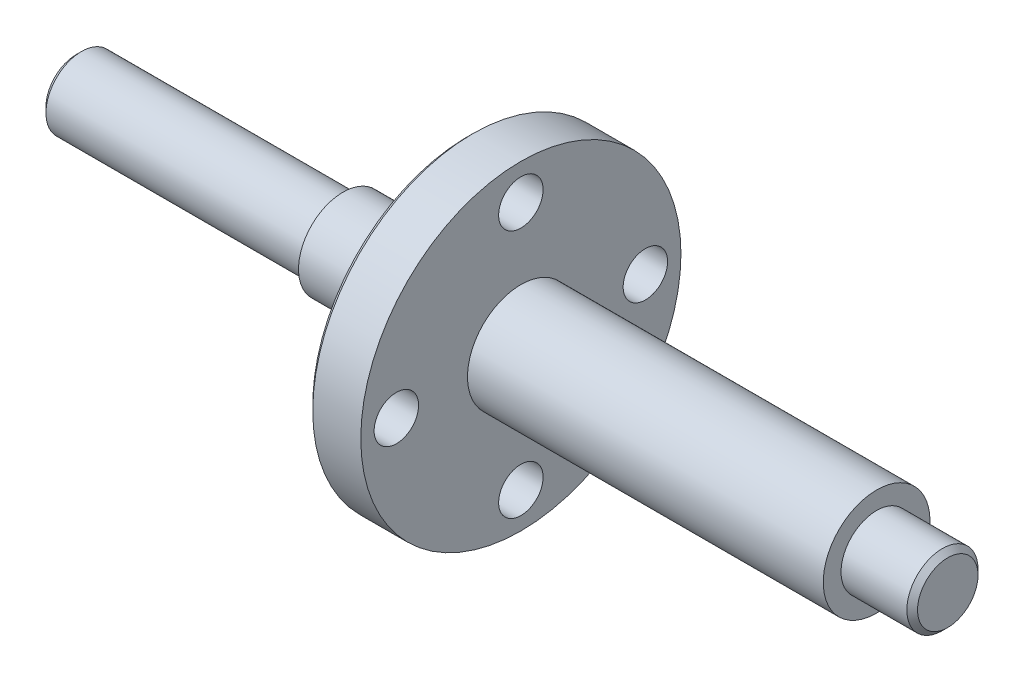
ISO-10303-21;
HEADER;
FILE_DESCRIPTION(('STEP AP214'),'2;1');
FILE_NAME('part.step','',(''),(''),'','','');
FILE_SCHEMA(('AUTOMOTIVE_DESIGN { 1 0 10303 214 1 1 1 1 }'));
ENDSEC;
DATA;
#1=APPLICATION_CONTEXT('core data for automotive mechanical design processes');
#2=APPLICATION_PROTOCOL_DEFINITION('international standard','automotive_design',2000,#1);
#3=PRODUCT_CONTEXT('',#1,'mechanical');
#4=PRODUCT('Part','Part','',(#3));
#5=PRODUCT_RELATED_PRODUCT_CATEGORY('part','',(#4));
#6=PRODUCT_DEFINITION_FORMATION('','',#4);
#7=PRODUCT_DEFINITION_CONTEXT('part definition',#1,'design');
#8=PRODUCT_DEFINITION('design','',#6,#7);
#9=PRODUCT_DEFINITION_SHAPE('','',#8);
#10=(LENGTH_UNIT() NAMED_UNIT(*) SI_UNIT(.MILLI.,.METRE.));
#11=(NAMED_UNIT(*) PLANE_ANGLE_UNIT() SI_UNIT($,.RADIAN.));
#12=(NAMED_UNIT(*) SI_UNIT($,.STERADIAN.) SOLID_ANGLE_UNIT());
#13=UNCERTAINTY_MEASURE_WITH_UNIT(LENGTH_MEASURE(1.E-05),#10,'distance_accuracy_value','');
#14=(GEOMETRIC_REPRESENTATION_CONTEXT(3) GLOBAL_UNCERTAINTY_ASSIGNED_CONTEXT((#13)) GLOBAL_UNIT_ASSIGNED_CONTEXT((#10,
#11,#12)) REPRESENTATION_CONTEXT('',''));
#15=CARTESIAN_POINT('',(0.,0.,0.));
#16=DIRECTION('',(0.,0.,1.));
#17=DIRECTION('',(1.,0.,0.));
#18=AXIS2_PLACEMENT_3D('',#15,#16,#17);
#19=CARTESIAN_POINT('',(22.,0.,0.));
#20=DIRECTION('',(1.,0.,0.));
#21=DIRECTION('',(0.,0.,-1.));
#22=AXIS2_PLACEMENT_3D('',#19,#20,#21);
#23=PLANE('',#22);
#24=CARTESIAN_POINT('',(22.,0.,0.));
#25=DIRECTION('',(1.,0.,0.));
#26=DIRECTION('',(0.,0.,-1.));
#27=AXIS2_PLACEMENT_3D('',#24,#25,#26);
#28=CIRCLE('',#27,8.7);
#29=CARTESIAN_POINT('',(22.,0.,-8.7));
#30=VERTEX_POINT('',#29);
#31=EDGE_CURVE('E54',#30,#30,#28,.F.);
#32=ORIENTED_EDGE('',*,*,#31,.T.);
#33=EDGE_LOOP('',(#32));
#34=FACE_BOUND('',#33,.T.);
#35=CARTESIAN_POINT('',(22.,0.,-7.));
#36=DIRECTION('',(-1.,0.,0.));
#37=DIRECTION('',(0.,0.,1.));
#38=AXIS2_PLACEMENT_3D('',#35,#36,#37);
#39=CIRCLE('',#38,1.24999999999999);
#40=CARTESIAN_POINT('',(22.,0.,-5.75000000000001));
#41=VERTEX_POINT('',#40);
#42=EDGE_CURVE('E108',#41,#41,#39,.T.);
#43=ORIENTED_EDGE('',*,*,#42,.F.);
#44=EDGE_LOOP('',(#43));
#45=FACE_BOUND('',#44,.T.);
#46=CARTESIAN_POINT('',(22.,-7.,0.));
#47=DIRECTION('',(-1.,0.,0.));
#48=DIRECTION('',(0.,0.,1.));
#49=AXIS2_PLACEMENT_3D('',#46,#47,#48);
#50=CIRCLE('',#49,1.24999999999999);
#51=CARTESIAN_POINT('',(22.,-7.,1.24999999999999));
#52=VERTEX_POINT('',#51);
#53=EDGE_CURVE('E102',#52,#52,#50,.T.);
#54=ORIENTED_EDGE('',*,*,#53,.F.);
#55=EDGE_LOOP('',(#54));
#56=FACE_BOUND('',#55,.T.);
#57=CARTESIAN_POINT('',(22.,0.,7.));
#58=DIRECTION('',(-1.,0.,0.));
#59=DIRECTION('',(0.,0.,1.));
#60=AXIS2_PLACEMENT_3D('',#57,#58,#59);
#61=CIRCLE('',#60,1.24999999999999);
#62=CARTESIAN_POINT('',(22.,0.,8.24999999999999));
#63=VERTEX_POINT('',#62);
#64=EDGE_CURVE('E96',#63,#63,#61,.T.);
#65=ORIENTED_EDGE('',*,*,#64,.F.);
#66=EDGE_LOOP('',(#65));
#67=FACE_BOUND('',#66,.T.);
#68=CARTESIAN_POINT('',(22.,0.,0.));
#69=DIRECTION('',(1.,0.,0.));
#70=DIRECTION('',(0.,0.,-1.));
#71=AXIS2_PLACEMENT_3D('',#68,#69,#70);
#72=CIRCLE('',#71,3.);
#73=CARTESIAN_POINT('',(22.,0.,-3.));
#74=VERTEX_POINT('',#73);
#75=EDGE_CURVE('E67',#74,#74,#72,.T.);
#76=ORIENTED_EDGE('',*,*,#75,.T.);
#77=EDGE_LOOP('',(#76));
#78=FACE_BOUND('',#77,.T.);
#79=CARTESIAN_POINT('',(22.,7.,0.));
#80=DIRECTION('',(-1.,0.,0.));
#81=DIRECTION('',(0.,0.,1.));
#82=AXIS2_PLACEMENT_3D('',#79,#80,#81);
#83=CIRCLE('',#82,1.24999999999999);
#84=CARTESIAN_POINT('',(22.,7.,1.24999999999999));
#85=VERTEX_POINT('',#84);
#86=EDGE_CURVE('E90',#85,#85,#83,.T.);
#87=ORIENTED_EDGE('',*,*,#86,.F.);
#88=EDGE_LOOP('',(#87));
#89=FACE_BOUND('',#88,.T.);
#90=ADVANCED_FACE('F34',(#34,#45,#56,#67,#78,#89),#23,.F.);
#91=CARTESIAN_POINT('',(15.,0.,0.));
#92=DIRECTION('',(-1.,0.,0.));
#93=DIRECTION('',(0.,0.,1.));
#94=AXIS2_PLACEMENT_3D('',#91,#92,#93);
#95=CYLINDRICAL_SURFACE('',#94,2.);
#96=CARTESIAN_POINT('',(0.300000000000007,0.,0.));
#97=DIRECTION('',(1.,0.,0.));
#98=DIRECTION('',(0.,0.,-1.));
#99=AXIS2_PLACEMENT_3D('',#96,#97,#98);
#100=CIRCLE('',#99,2.);
#101=CARTESIAN_POINT('',(0.300000000000007,0.,-2.));
#102=VERTEX_POINT('',#101);
#103=EDGE_CURVE('E49',#102,#102,#100,.T.);
#104=ORIENTED_EDGE('',*,*,#103,.T.);
#105=EDGE_LOOP('',(#104));
#106=FACE_BOUND('',#105,.T.);
#107=CARTESIAN_POINT('',(15.,0.,0.));
#108=DIRECTION('',(1.,0.,0.));
#109=DIRECTION('',(0.,0.,-1.));
#110=AXIS2_PLACEMENT_3D('',#107,#108,#109);
#111=CIRCLE('',#110,2.);
#112=CARTESIAN_POINT('',(15.,0.,-2.));
#113=VERTEX_POINT('',#112);
#114=EDGE_CURVE('E60',#113,#113,#111,.T.);
#115=ORIENTED_EDGE('',*,*,#114,.F.);
#116=EDGE_LOOP('',(#115));
#117=FACE_BOUND('',#116,.T.);
#118=ADVANCED_FACE('F117',(#106,#117),#95,.T.);
#119=CARTESIAN_POINT('',(0.,0.,0.));
#120=DIRECTION('',(1.,0.,0.));
#121=DIRECTION('',(0.,0.,-1.));
#122=AXIS2_PLACEMENT_3D('',#119,#120,#121);
#123=PLANE('',#122);
#124=CARTESIAN_POINT('',(0.,0.,0.));
#125=DIRECTION('',(1.,0.,0.));
#126=DIRECTION('',(0.,0.,-1.));
#127=AXIS2_PLACEMENT_3D('',#124,#125,#126);
#128=CIRCLE('',#127,1.69999999999999);
#129=CARTESIAN_POINT('',(0.,0.,-1.69999999999999));
#130=VERTEX_POINT('',#129);
#131=EDGE_CURVE('E45',#130,#130,#128,.F.);
#132=ORIENTED_EDGE('',*,*,#131,.T.);
#133=EDGE_LOOP('',(#132));
#134=FACE_BOUND('',#133,.T.);
#135=ADVANCED_FACE('F168',(#134),#123,.F.);
#136=CARTESIAN_POINT('',(19.,0.,0.));
#137=DIRECTION('',(-1.,0.,0.));
#138=DIRECTION('',(0.,0.,1.));
#139=AXIS2_PLACEMENT_3D('',#136,#137,#138);
#140=CYLINDRICAL_SURFACE('',#139,2.5);
#141=CARTESIAN_POINT('',(19.,0.,0.));
#142=DIRECTION('',(1.,0.,0.));
#143=DIRECTION('',(0.,0.,-1.));
#144=AXIS2_PLACEMENT_3D('',#141,#142,#143);
#145=CIRCLE('',#144,2.5);
#146=CARTESIAN_POINT('',(19.,0.,-2.5));
#147=VERTEX_POINT('',#146);
#148=EDGE_CURVE('E63',#147,#147,#145,.T.);
#149=ORIENTED_EDGE('',*,*,#148,.F.);
#150=EDGE_LOOP('',(#149));
#151=FACE_BOUND('',#150,.T.);
#152=CARTESIAN_POINT('',(15.,0.,0.));
#153=DIRECTION('',(1.,0.,0.));
#154=DIRECTION('',(0.,0.,-1.));
#155=AXIS2_PLACEMENT_3D('',#152,#153,#154);
#156=CIRCLE('',#155,2.5);
#157=CARTESIAN_POINT('',(15.,0.,-2.5));
#158=VERTEX_POINT('',#157);
#159=EDGE_CURVE('E64',#158,#158,#156,.T.);
#160=ORIENTED_EDGE('',*,*,#159,.T.);
#161=EDGE_LOOP('',(#160));
#162=FACE_BOUND('',#161,.T.);
#163=ADVANCED_FACE('F164',(#151,#162),#140,.T.);
#164=CARTESIAN_POINT('',(15.,0.,0.));
#165=DIRECTION('',(1.,0.,0.));
#166=DIRECTION('',(0.,0.,-1.));
#167=AXIS2_PLACEMENT_3D('',#164,#165,#166);
#168=PLANE('',#167);
#169=ORIENTED_EDGE('',*,*,#114,.T.);
#170=EDGE_LOOP('',(#169));
#171=FACE_BOUND('',#170,.T.);
#172=ORIENTED_EDGE('',*,*,#159,.F.);
#173=EDGE_LOOP('',(#172));
#174=FACE_BOUND('',#173,.T.);
#175=ADVANCED_FACE('F160',(#171,#174),#168,.F.);
#176=CARTESIAN_POINT('',(22.,0.,0.));
#177=DIRECTION('',(-1.,0.,0.));
#178=DIRECTION('',(0.,0.,1.));
#179=AXIS2_PLACEMENT_3D('',#176,#177,#178);
#180=CYLINDRICAL_SURFACE('',#179,3.);
#181=ORIENTED_EDGE('',*,*,#75,.F.);
#182=EDGE_LOOP('',(#181));
#183=FACE_BOUND('',#182,.T.);
#184=CARTESIAN_POINT('',(19.,0.,0.));
#185=DIRECTION('',(1.,0.,0.));
#186=DIRECTION('',(0.,0.,-1.));
#187=AXIS2_PLACEMENT_3D('',#184,#185,#186);
#188=CIRCLE('',#187,3.);
#189=CARTESIAN_POINT('',(19.,0.,-3.));
#190=VERTEX_POINT('',#189);
#191=EDGE_CURVE('E70',#190,#190,#188,.T.);
#192=ORIENTED_EDGE('',*,*,#191,.T.);
#193=EDGE_LOOP('',(#192));
#194=FACE_BOUND('',#193,.T.);
#195=ADVANCED_FACE('F154',(#183,#194),#180,.T.);
#196=CARTESIAN_POINT('',(19.,0.,0.));
#197=DIRECTION('',(1.,0.,0.));
#198=DIRECTION('',(0.,0.,-1.));
#199=AXIS2_PLACEMENT_3D('',#196,#197,#198);
#200=PLANE('',#199);
#201=ORIENTED_EDGE('',*,*,#148,.T.);
#202=EDGE_LOOP('',(#201));
#203=FACE_BOUND('',#202,.T.);
#204=ORIENTED_EDGE('',*,*,#191,.F.);
#205=EDGE_LOOP('',(#204));
#206=FACE_BOUND('',#205,.T.);
#207=ADVANCED_FACE('F148',(#203,#206),#200,.F.);
#208=CARTESIAN_POINT('',(25.,0.,0.));
#209=DIRECTION('',(-1.,0.,0.));
#210=DIRECTION('',(0.,0.,1.));
#211=AXIS2_PLACEMENT_3D('',#208,#209,#210);
#212=CYLINDRICAL_SURFACE('',#211,9.);
#213=CARTESIAN_POINT('',(22.3,0.,0.));
#214=DIRECTION('',(1.,0.,0.));
#215=DIRECTION('',(0.,0.,-1.));
#216=AXIS2_PLACEMENT_3D('',#213,#214,#215);
#217=CIRCLE('',#216,9.);
#218=CARTESIAN_POINT('',(22.3,0.,-9.));
#219=VERTEX_POINT('',#218);
#220=EDGE_CURVE('E57',#219,#219,#217,.T.);
#221=ORIENTED_EDGE('',*,*,#220,.T.);
#222=EDGE_LOOP('',(#221));
#223=FACE_BOUND('',#222,.T.);
#224=CARTESIAN_POINT('',(25.,0.,0.));
#225=DIRECTION('',(1.,0.,0.));
#226=DIRECTION('',(0.,0.,-1.));
#227=AXIS2_PLACEMENT_3D('',#224,#225,#226);
#228=CIRCLE('',#227,9.);
#229=CARTESIAN_POINT('',(25.,0.,-9.));
#230=VERTEX_POINT('',#229);
#231=EDGE_CURVE('E73',#230,#230,#228,.T.);
#232=ORIENTED_EDGE('',*,*,#231,.F.);
#233=EDGE_LOOP('',(#232));
#234=FACE_BOUND('',#233,.T.);
#235=ADVANCED_FACE('F140',(#223,#234),#212,.T.);
#236=CARTESIAN_POINT('',(25.,0.,0.));
#237=DIRECTION('',(1.,0.,0.));
#238=DIRECTION('',(0.,0.,-1.));
#239=AXIS2_PLACEMENT_3D('',#236,#237,#238);
#240=PLANE('',#239);
#241=CARTESIAN_POINT('',(25.,0.,-7.));
#242=DIRECTION('',(1.,0.,0.));
#243=DIRECTION('',(0.,0.,-1.));
#244=AXIS2_PLACEMENT_3D('',#241,#242,#243);
#245=CIRCLE('',#244,1.24999999999999);
#246=CARTESIAN_POINT('',(25.,0.,-8.24999999999999));
#247=VERTEX_POINT('',#246);
#248=EDGE_CURVE('E105',#247,#247,#245,.T.);
#249=ORIENTED_EDGE('',*,*,#248,.F.);
#250=EDGE_LOOP('',(#249));
#251=FACE_BOUND('',#250,.T.);
#252=CARTESIAN_POINT('',(25.,-7.,0.));
#253=DIRECTION('',(1.,0.,0.));
#254=DIRECTION('',(0.,0.,-1.));
#255=AXIS2_PLACEMENT_3D('',#252,#253,#254);
#256=CIRCLE('',#255,1.24999999999999);
#257=CARTESIAN_POINT('',(25.,-7.,-1.24999999999999));
#258=VERTEX_POINT('',#257);
#259=EDGE_CURVE('E99',#258,#258,#256,.T.);
#260=ORIENTED_EDGE('',*,*,#259,.F.);
#261=EDGE_LOOP('',(#260));
#262=FACE_BOUND('',#261,.T.);
#263=CARTESIAN_POINT('',(25.,0.,7.));
#264=DIRECTION('',(1.,0.,0.));
#265=DIRECTION('',(0.,0.,-1.));
#266=AXIS2_PLACEMENT_3D('',#263,#264,#265);
#267=CIRCLE('',#266,1.24999999999999);
#268=CARTESIAN_POINT('',(25.,0.,5.75000000000001));
#269=VERTEX_POINT('',#268);
#270=EDGE_CURVE('E93',#269,#269,#267,.T.);
#271=ORIENTED_EDGE('',*,*,#270,.F.);
#272=EDGE_LOOP('',(#271));
#273=FACE_BOUND('',#272,.T.);
#274=CARTESIAN_POINT('',(25.,7.,0.));
#275=DIRECTION('',(1.,0.,0.));
#276=DIRECTION('',(0.,0.,-1.));
#277=AXIS2_PLACEMENT_3D('',#274,#275,#276);
#278=CIRCLE('',#277,1.24999999999999);
#279=CARTESIAN_POINT('',(25.,7.,-1.24999999999999));
#280=VERTEX_POINT('',#279);
#281=EDGE_CURVE('E87',#280,#280,#278,.T.);
#282=ORIENTED_EDGE('',*,*,#281,.F.);
#283=EDGE_LOOP('',(#282));
#284=FACE_BOUND('',#283,.T.);
#285=CARTESIAN_POINT('',(25.,0.,0.));
#286=DIRECTION('',(1.,0.,0.));
#287=DIRECTION('',(0.,0.,-1.));
#288=AXIS2_PLACEMENT_3D('',#285,#286,#287);
#289=CIRCLE('',#288,3.);
#290=CARTESIAN_POINT('',(25.,0.,-3.));
#291=VERTEX_POINT('',#290);
#292=EDGE_CURVE('E79',#291,#291,#289,.T.);
#293=ORIENTED_EDGE('',*,*,#292,.F.);
#294=EDGE_LOOP('',(#293));
#295=FACE_BOUND('',#294,.T.);
#296=ORIENTED_EDGE('',*,*,#231,.T.);
#297=EDGE_LOOP('',(#296));
#298=FACE_BOUND('',#297,.T.);
#299=ADVANCED_FACE('F136',(#251,#262,#273,#284,#295,#298),#240,.T.);
#300=CARTESIAN_POINT('',(45.,0.,0.));
#301=DIRECTION('',(-1.,0.,0.));
#302=DIRECTION('',(0.,0.,1.));
#303=AXIS2_PLACEMENT_3D('',#300,#301,#302);
#304=CYLINDRICAL_SURFACE('',#303,3.);
#305=CARTESIAN_POINT('',(45.,0.,0.));
#306=DIRECTION('',(1.,0.,0.));
#307=DIRECTION('',(0.,0.,-1.));
#308=AXIS2_PLACEMENT_3D('',#305,#306,#307);
#309=CIRCLE('',#308,3.);
#310=CARTESIAN_POINT('',(45.,0.,-3.));
#311=VERTEX_POINT('',#310);
#312=EDGE_CURVE('E78',#311,#311,#309,.T.);
#313=ORIENTED_EDGE('',*,*,#312,.F.);
#314=EDGE_LOOP('',(#313));
#315=FACE_BOUND('',#314,.T.);
#316=ORIENTED_EDGE('',*,*,#292,.T.);
#317=EDGE_LOOP('',(#316));
#318=FACE_BOUND('',#317,.T.);
#319=ADVANCED_FACE('F139',(#315,#318),#304,.T.);
#320=CARTESIAN_POINT('',(45.,0.,0.));
#321=DIRECTION('',(1.,0.,0.));
#322=DIRECTION('',(0.,0.,-1.));
#323=AXIS2_PLACEMENT_3D('',#320,#321,#322);
#324=PLANE('',#323);
#325=CARTESIAN_POINT('',(45.,0.,0.));
#326=DIRECTION('',(1.,0.,0.));
#327=DIRECTION('',(0.,0.,-1.));
#328=AXIS2_PLACEMENT_3D('',#325,#326,#327);
#329=CIRCLE('',#328,2.);
#330=CARTESIAN_POINT('',(45.,0.,-2.));
#331=VERTEX_POINT('',#330);
#332=EDGE_CURVE('E82',#331,#331,#329,.T.);
#333=ORIENTED_EDGE('',*,*,#332,.F.);
#334=EDGE_LOOP('',(#333));
#335=FACE_BOUND('',#334,.T.);
#336=ORIENTED_EDGE('',*,*,#312,.T.);
#337=EDGE_LOOP('',(#336));
#338=FACE_BOUND('',#337,.T.);
#339=ADVANCED_FACE('F227',(#335,#338),#324,.T.);
#340=CARTESIAN_POINT('',(49.,0.,0.));
#341=DIRECTION('',(-1.,0.,0.));
#342=DIRECTION('',(0.,0.,1.));
#343=AXIS2_PLACEMENT_3D('',#340,#341,#342);
#344=CYLINDRICAL_SURFACE('',#343,2.);
#345=CARTESIAN_POINT('',(48.7,0.,0.));
#346=DIRECTION('',(1.,0.,0.));
#347=DIRECTION('',(0.,0.,-1.));
#348=AXIS2_PLACEMENT_3D('',#345,#346,#347);
#349=CIRCLE('',#348,2.);
#350=CARTESIAN_POINT('',(48.7,0.,-2.));
#351=VERTEX_POINT('',#350);
#352=EDGE_CURVE('E10',#351,#351,#349,.F.);
#353=ORIENTED_EDGE('',*,*,#352,.T.);
#354=EDGE_LOOP('',(#353));
#355=FACE_BOUND('',#354,.T.);
#356=ORIENTED_EDGE('',*,*,#332,.T.);
#357=EDGE_LOOP('',(#356));
#358=FACE_BOUND('',#357,.T.);
#359=ADVANCED_FACE('F218',(#355,#358),#344,.T.);
#360=CARTESIAN_POINT('',(49.,0.,0.));
#361=DIRECTION('',(1.,0.,0.));
#362=DIRECTION('',(0.,0.,-1.));
#363=AXIS2_PLACEMENT_3D('',#360,#361,#362);
#364=PLANE('',#363);
#365=CARTESIAN_POINT('',(49.,0.,0.));
#366=DIRECTION('',(1.,0.,0.));
#367=DIRECTION('',(0.,0.,-1.));
#368=AXIS2_PLACEMENT_3D('',#365,#366,#367);
#369=CIRCLE('',#368,1.69999999999999);
#370=CARTESIAN_POINT('',(49.,0.,-1.69999999999999));
#371=VERTEX_POINT('',#370);
#372=EDGE_CURVE('E41',#371,#371,#369,.T.);
#373=ORIENTED_EDGE('',*,*,#372,.T.);
#374=EDGE_LOOP('',(#373));
#375=FACE_BOUND('',#374,.T.);
#376=ADVANCED_FACE('F132',(#375),#364,.T.);
#377=CARTESIAN_POINT('',(22.,7.,0.));
#378=DIRECTION('',(-1.,0.,0.));
#379=DIRECTION('',(0.,0.,1.));
#380=AXIS2_PLACEMENT_3D('',#377,#378,#379);
#381=CYLINDRICAL_SURFACE('',#380,1.24999999999999);
#382=ORIENTED_EDGE('',*,*,#86,.T.);
#383=EDGE_LOOP('',(#382));
#384=FACE_BOUND('',#383,.T.);
#385=ORIENTED_EDGE('',*,*,#281,.T.);
#386=EDGE_LOOP('',(#385));
#387=FACE_BOUND('',#386,.T.);
#388=ADVANCED_FACE('F128',(#384,#387),#381,.F.);
#389=CARTESIAN_POINT('',(22.,0.,7.));
#390=DIRECTION('',(-1.,0.,0.));
#391=DIRECTION('',(0.,0.,1.));
#392=AXIS2_PLACEMENT_3D('',#389,#390,#391);
#393=CYLINDRICAL_SURFACE('',#392,1.24999999999999);
#394=ORIENTED_EDGE('',*,*,#64,.T.);
#395=EDGE_LOOP('',(#394));
#396=FACE_BOUND('',#395,.T.);
#397=ORIENTED_EDGE('',*,*,#270,.T.);
#398=EDGE_LOOP('',(#397));
#399=FACE_BOUND('',#398,.T.);
#400=ADVANCED_FACE('F131',(#396,#399),#393,.F.);
#401=CARTESIAN_POINT('',(22.,-7.,0.));
#402=DIRECTION('',(-1.,0.,0.));
#403=DIRECTION('',(0.,0.,1.));
#404=AXIS2_PLACEMENT_3D('',#401,#402,#403);
#405=CYLINDRICAL_SURFACE('',#404,1.24999999999999);
#406=ORIENTED_EDGE('',*,*,#53,.T.);
#407=EDGE_LOOP('',(#406));
#408=FACE_BOUND('',#407,.T.);
#409=ORIENTED_EDGE('',*,*,#259,.T.);
#410=EDGE_LOOP('',(#409));
#411=FACE_BOUND('',#410,.T.);
#412=ADVANCED_FACE('F263',(#408,#411),#405,.F.);
#413=CARTESIAN_POINT('',(22.,0.,-7.));
#414=DIRECTION('',(-1.,0.,0.));
#415=DIRECTION('',(0.,0.,1.));
#416=AXIS2_PLACEMENT_3D('',#413,#414,#415);
#417=CYLINDRICAL_SURFACE('',#416,1.24999999999999);
#418=ORIENTED_EDGE('',*,*,#42,.T.);
#419=EDGE_LOOP('',(#418));
#420=FACE_BOUND('',#419,.T.);
#421=ORIENTED_EDGE('',*,*,#248,.T.);
#422=EDGE_LOOP('',(#421));
#423=FACE_BOUND('',#422,.T.);
#424=ADVANCED_FACE('F112',(#420,#423),#417,.F.);
#425=CARTESIAN_POINT('',(22.3,0.,0.));
#426=DIRECTION('',(1.,0.,0.));
#427=DIRECTION('',(0.,0.,-1.));
#428=AXIS2_PLACEMENT_3D('',#425,#426,#427);
#429=CONICAL_SURFACE('',#428,9.,0.78539816339744);
#430=ORIENTED_EDGE('',*,*,#31,.F.);
#431=EDGE_LOOP('',(#430));
#432=FACE_BOUND('',#431,.T.);
#433=ORIENTED_EDGE('',*,*,#220,.F.);
#434=EDGE_LOOP('',(#433));
#435=FACE_BOUND('',#434,.T.);
#436=ADVANCED_FACE('F176',(#432,#435),#429,.T.);
#437=CARTESIAN_POINT('',(0.300000000000007,0.,0.));
#438=DIRECTION('',(1.,0.,0.));
#439=DIRECTION('',(0.,0.,-1.));
#440=AXIS2_PLACEMENT_3D('',#437,#438,#439);
#441=CONICAL_SURFACE('',#440,2.,0.785398163397448);
#442=ORIENTED_EDGE('',*,*,#131,.F.);
#443=EDGE_LOOP('',(#442));
#444=FACE_BOUND('',#443,.T.);
#445=ORIENTED_EDGE('',*,*,#103,.F.);
#446=EDGE_LOOP('',(#445));
#447=FACE_BOUND('',#446,.T.);
#448=ADVANCED_FACE('F178',(#444,#447),#441,.T.);
#449=CARTESIAN_POINT('',(49.,0.,0.));
#450=DIRECTION('',(-1.,0.,0.));
#451=DIRECTION('',(0.,0.,1.));
#452=AXIS2_PLACEMENT_3D('',#449,#450,#451);
#453=CONICAL_SURFACE('',#452,1.69999999999999,0.785398163397457);
#454=ORIENTED_EDGE('',*,*,#352,.F.);
#455=EDGE_LOOP('',(#454));
#456=FACE_BOUND('',#455,.T.);
#457=ORIENTED_EDGE('',*,*,#372,.F.);
#458=EDGE_LOOP('',(#457));
#459=FACE_BOUND('',#458,.T.);
#460=ADVANCED_FACE('F36',(#456,#459),#453,.T.);
#461=CLOSED_SHELL('',(#90,#118,#135,#163,#175,#195,#207,#235,#299,#319,#339,#359,#376,#388,#400,
#412,#424,#436,#448,#460));
#462=MANIFOLD_SOLID_BREP('B2',#461);
#463=ADVANCED_BREP_SHAPE_REPRESENTATION('',(#18,#462),#14);
#464=SHAPE_DEFINITION_REPRESENTATION(#9,#463);
ENDSEC;
END-ISO-10303-21;
